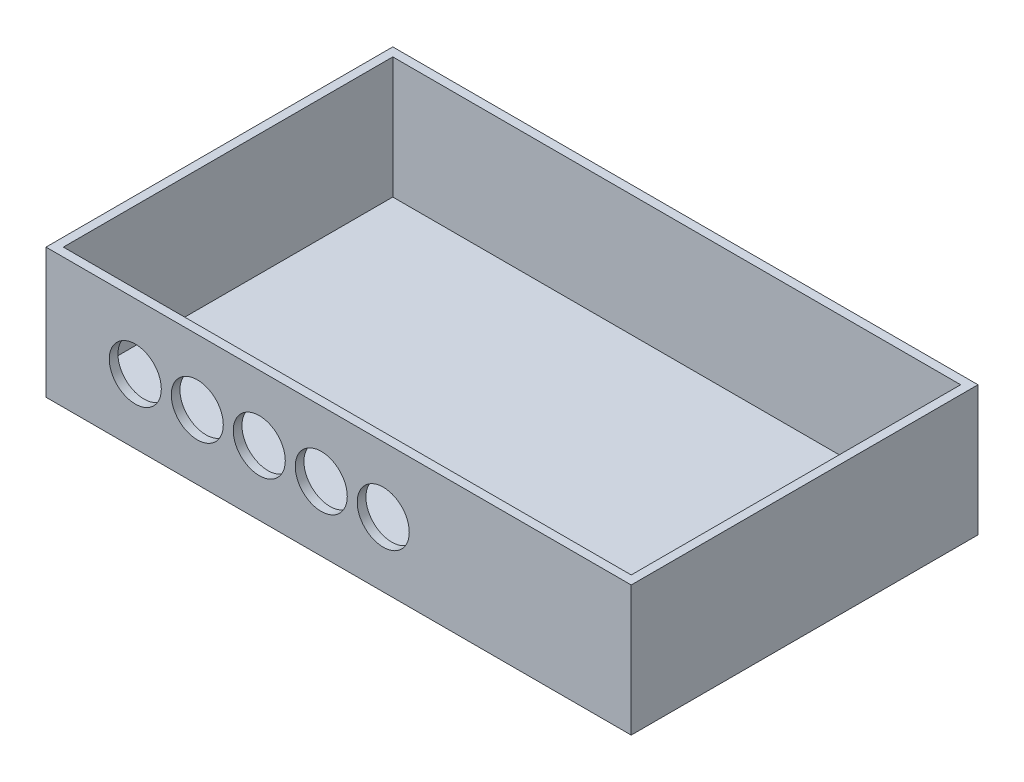
ISO-10303-21;
HEADER;
FILE_DESCRIPTION(('STEP AP214'),'2;1');
FILE_NAME('part.step','',(''),(''),'','','');
FILE_SCHEMA(('AUTOMOTIVE_DESIGN { 1 0 10303 214 1 1 1 1 }'));
ENDSEC;
DATA;
#1=APPLICATION_CONTEXT('core data for automotive mechanical design processes');
#2=APPLICATION_PROTOCOL_DEFINITION('international standard','automotive_design',2000,#1);
#3=PRODUCT_CONTEXT('',#1,'mechanical');
#4=PRODUCT('Part','Part','',(#3));
#5=PRODUCT_RELATED_PRODUCT_CATEGORY('part','',(#4));
#6=PRODUCT_DEFINITION_FORMATION('','',#4);
#7=PRODUCT_DEFINITION_CONTEXT('part definition',#1,'design');
#8=PRODUCT_DEFINITION('design','',#6,#7);
#9=PRODUCT_DEFINITION_SHAPE('','',#8);
#10=(LENGTH_UNIT() NAMED_UNIT(*) SI_UNIT(.MILLI.,.METRE.));
#11=(NAMED_UNIT(*) PLANE_ANGLE_UNIT() SI_UNIT($,.RADIAN.));
#12=(NAMED_UNIT(*) SI_UNIT($,.STERADIAN.) SOLID_ANGLE_UNIT());
#13=UNCERTAINTY_MEASURE_WITH_UNIT(LENGTH_MEASURE(1.E-05),#10,'distance_accuracy_value','');
#14=(GEOMETRIC_REPRESENTATION_CONTEXT(3) GLOBAL_UNCERTAINTY_ASSIGNED_CONTEXT((#13)) GLOBAL_UNIT_ASSIGNED_CONTEXT((#10,
#11,#12)) REPRESENTATION_CONTEXT('',''));
#15=CARTESIAN_POINT('',(0.,0.,0.));
#16=DIRECTION('',(0.,0.,1.));
#17=DIRECTION('',(1.,0.,0.));
#18=AXIS2_PLACEMENT_3D('',#15,#16,#17);
#19=CARTESIAN_POINT('',(0.,30.,0.));
#20=DIRECTION('',(0.,-1.,0.));
#21=DIRECTION('',(0.,0.,-1.));
#22=AXIS2_PLACEMENT_3D('',#19,#20,#21);
#23=PLANE('',#22);
#24=DIRECTION('',(0.,0.,1.));
#25=VECTOR('',#24,1.);
#26=CARTESIAN_POINT('',(0.,30.,0.));
#27=LINE('',#26,#25);
#28=CARTESIAN_POINT('',(0.,30.,-80.));
#29=VERTEX_POINT('',#28);
#30=CARTESIAN_POINT('',(0.,30.,0.));
#31=VERTEX_POINT('',#30);
#32=EDGE_CURVE('E143',#29,#31,#27,.T.);
#33=ORIENTED_EDGE('',*,*,#32,.T.);
#34=DIRECTION('',(1.,0.,0.));
#35=VECTOR('',#34,1.);
#36=CARTESIAN_POINT('',(0.,30.,0.));
#37=LINE('',#36,#35);
#38=CARTESIAN_POINT('',(135.,30.,0.));
#39=VERTEX_POINT('',#38);
#40=EDGE_CURVE('E87',#31,#39,#37,.T.);
#41=ORIENTED_EDGE('',*,*,#40,.T.);
#42=DIRECTION('',(0.,0.,-1.));
#43=VECTOR('',#42,1.);
#44=CARTESIAN_POINT('',(135.,30.,0.));
#45=LINE('',#44,#43);
#46=CARTESIAN_POINT('',(135.,30.,-80.));
#47=VERTEX_POINT('',#46);
#48=EDGE_CURVE('E146',#39,#47,#45,.T.);
#49=ORIENTED_EDGE('',*,*,#48,.T.);
#50=DIRECTION('',(-1.,0.,0.));
#51=VECTOR('',#50,1.);
#52=CARTESIAN_POINT('',(0.,30.,-80.));
#53=LINE('',#52,#51);
#54=EDGE_CURVE('E59',#47,#29,#53,.T.);
#55=ORIENTED_EDGE('',*,*,#54,.T.);
#56=EDGE_LOOP('',(#33,#41,#49,#55));
#57=FACE_BOUND('',#56,.T.);
#58=DIRECTION('',(0.,0.,1.));
#59=VECTOR('',#58,1.);
#60=CARTESIAN_POINT('',(2.,30.,0.));
#61=LINE('',#60,#59);
#62=CARTESIAN_POINT('',(2.,30.,-78.));
#63=VERTEX_POINT('',#62);
#64=CARTESIAN_POINT('',(2.,30.,-2.));
#65=VERTEX_POINT('',#64);
#66=EDGE_CURVE('E132',#63,#65,#61,.T.);
#67=ORIENTED_EDGE('',*,*,#66,.F.);
#68=DIRECTION('',(-1.,0.,0.));
#69=VECTOR('',#68,1.);
#70=CARTESIAN_POINT('',(0.,30.,-78.));
#71=LINE('',#70,#69);
#72=CARTESIAN_POINT('',(133.,30.,-78.));
#73=VERTEX_POINT('',#72);
#74=EDGE_CURVE('E141',#73,#63,#71,.T.);
#75=ORIENTED_EDGE('',*,*,#74,.F.);
#76=DIRECTION('',(0.,0.,-1.));
#77=VECTOR('',#76,1.);
#78=CARTESIAN_POINT('',(133.,30.,0.));
#79=LINE('',#78,#77);
#80=CARTESIAN_POINT('',(133.,30.,-2.));
#81=VERTEX_POINT('',#80);
#82=EDGE_CURVE('E139',#81,#73,#79,.T.);
#83=ORIENTED_EDGE('',*,*,#82,.F.);
#84=DIRECTION('',(1.,0.,0.));
#85=VECTOR('',#84,1.);
#86=CARTESIAN_POINT('',(0.,30.,-2.));
#87=LINE('',#86,#85);
#88=EDGE_CURVE('E124',#65,#81,#87,.T.);
#89=ORIENTED_EDGE('',*,*,#88,.F.);
#90=EDGE_LOOP('',(#67,#75,#83,#89));
#91=FACE_BOUND('',#90,.T.);
#92=ADVANCED_FACE('F33',(#57,#91),#23,.F.);
#93=CARTESIAN_POINT('',(0.,30.,0.));
#94=DIRECTION('',(1.,0.,0.));
#95=DIRECTION('',(0.,0.,-1.));
#96=AXIS2_PLACEMENT_3D('',#93,#94,#95);
#97=PLANE('',#96);
#98=DIRECTION('',(0.,0.,1.));
#99=VECTOR('',#98,1.);
#100=CARTESIAN_POINT('',(0.,0.,0.));
#101=LINE('',#100,#99);
#102=CARTESIAN_POINT('',(0.,0.,-80.));
#103=VERTEX_POINT('',#102);
#104=CARTESIAN_POINT('',(0.,0.,0.));
#105=VERTEX_POINT('',#104);
#106=EDGE_CURVE('E150',#103,#105,#101,.T.);
#107=ORIENTED_EDGE('',*,*,#106,.T.);
#108=DIRECTION('',(0.,-1.,0.));
#109=VECTOR('',#108,1.);
#110=CARTESIAN_POINT('',(0.,30.,0.));
#111=LINE('',#110,#109);
#112=EDGE_CURVE('E11',#31,#105,#111,.T.);
#113=ORIENTED_EDGE('',*,*,#112,.F.);
#114=ORIENTED_EDGE('',*,*,#32,.F.);
#115=DIRECTION('',(0.,-1.,0.));
#116=VECTOR('',#115,1.);
#117=CARTESIAN_POINT('',(0.,30.,-80.));
#118=LINE('',#117,#116);
#119=EDGE_CURVE('E149',#29,#103,#118,.T.);
#120=ORIENTED_EDGE('',*,*,#119,.T.);
#121=EDGE_LOOP('',(#107,#113,#114,#120));
#122=FACE_BOUND('',#121,.T.);
#123=ADVANCED_FACE('F35',(#122),#97,.F.);
#124=CARTESIAN_POINT('',(0.,30.,0.));
#125=DIRECTION('',(0.,0.,-1.));
#126=DIRECTION('',(-1.,0.,0.));
#127=AXIS2_PLACEMENT_3D('',#124,#125,#126);
#128=PLANE('',#127);
#129=CARTESIAN_POINT('',(20.6,14.94,0.));
#130=DIRECTION('',(0.,0.,1.));
#131=DIRECTION('',(1.,0.,0.));
#132=AXIS2_PLACEMENT_3D('',#129,#130,#131);
#133=CIRCLE('',#132,6.);
#134=CARTESIAN_POINT('',(26.6,14.94,0.));
#135=VERTEX_POINT('',#134);
#136=EDGE_CURVE('E167',#135,#135,#133,.T.);
#137=ORIENTED_EDGE('',*,*,#136,.F.);
#138=EDGE_LOOP('',(#137));
#139=FACE_BOUND('',#138,.T.);
#140=CARTESIAN_POINT('',(34.9,14.94,0.));
#141=DIRECTION('',(0.,0.,1.));
#142=DIRECTION('',(1.,0.,0.));
#143=AXIS2_PLACEMENT_3D('',#140,#141,#142);
#144=CIRCLE('',#143,6.);
#145=CARTESIAN_POINT('',(40.9,14.94,0.));
#146=VERTEX_POINT('',#145);
#147=EDGE_CURVE('E225',#146,#146,#144,.T.);
#148=ORIENTED_EDGE('',*,*,#147,.F.);
#149=EDGE_LOOP('',(#148));
#150=FACE_BOUND('',#149,.T.);
#151=CARTESIAN_POINT('',(49.2,14.94,0.));
#152=DIRECTION('',(0.,0.,1.));
#153=DIRECTION('',(1.,0.,0.));
#154=AXIS2_PLACEMENT_3D('',#151,#152,#153);
#155=CIRCLE('',#154,5.99999999999999);
#156=CARTESIAN_POINT('',(55.2,14.94,0.));
#157=VERTEX_POINT('',#156);
#158=EDGE_CURVE('E229',#157,#157,#155,.T.);
#159=ORIENTED_EDGE('',*,*,#158,.F.);
#160=EDGE_LOOP('',(#159));
#161=FACE_BOUND('',#160,.T.);
#162=CARTESIAN_POINT('',(63.5,14.94,0.));
#163=DIRECTION('',(0.,0.,1.));
#164=DIRECTION('',(1.,0.,0.));
#165=AXIS2_PLACEMENT_3D('',#162,#163,#164);
#166=CIRCLE('',#165,6.);
#167=CARTESIAN_POINT('',(69.5,14.94,0.));
#168=VERTEX_POINT('',#167);
#169=EDGE_CURVE('E233',#168,#168,#166,.T.);
#170=ORIENTED_EDGE('',*,*,#169,.F.);
#171=EDGE_LOOP('',(#170));
#172=FACE_BOUND('',#171,.T.);
#173=CARTESIAN_POINT('',(77.8,14.94,0.));
#174=DIRECTION('',(0.,0.,1.));
#175=DIRECTION('',(1.,0.,0.));
#176=AXIS2_PLACEMENT_3D('',#173,#174,#175);
#177=CIRCLE('',#176,6.);
#178=CARTESIAN_POINT('',(83.8,14.94,0.));
#179=VERTEX_POINT('',#178);
#180=EDGE_CURVE('E182',#179,#179,#177,.T.);
#181=ORIENTED_EDGE('',*,*,#180,.F.);
#182=EDGE_LOOP('',(#181));
#183=FACE_BOUND('',#182,.T.);
#184=DIRECTION('',(1.,0.,0.));
#185=VECTOR('',#184,1.);
#186=CARTESIAN_POINT('',(0.,0.,0.));
#187=LINE('',#186,#185);
#188=CARTESIAN_POINT('',(135.,0.,0.));
#189=VERTEX_POINT('',#188);
#190=EDGE_CURVE('E153',#105,#189,#187,.T.);
#191=ORIENTED_EDGE('',*,*,#190,.T.);
#192=DIRECTION('',(0.,-1.,0.));
#193=VECTOR('',#192,1.);
#194=CARTESIAN_POINT('',(135.,30.,0.));
#195=LINE('',#194,#193);
#196=EDGE_CURVE('E42',#39,#189,#195,.T.);
#197=ORIENTED_EDGE('',*,*,#196,.F.);
#198=ORIENTED_EDGE('',*,*,#40,.F.);
#199=ORIENTED_EDGE('',*,*,#112,.T.);
#200=EDGE_LOOP('',(#191,#197,#198,#199));
#201=FACE_BOUND('',#200,.T.);
#202=ADVANCED_FACE('F198',(#139,#150,#161,#172,#183,#201),#128,.F.);
#203=CARTESIAN_POINT('',(135.,30.,0.));
#204=DIRECTION('',(-1.,0.,0.));
#205=DIRECTION('',(0.,0.,1.));
#206=AXIS2_PLACEMENT_3D('',#203,#204,#205);
#207=PLANE('',#206);
#208=DIRECTION('',(0.,0.,-1.));
#209=VECTOR('',#208,1.);
#210=CARTESIAN_POINT('',(135.,0.,0.));
#211=LINE('',#210,#209);
#212=CARTESIAN_POINT('',(135.,0.,-80.));
#213=VERTEX_POINT('',#212);
#214=EDGE_CURVE('E155',#189,#213,#211,.T.);
#215=ORIENTED_EDGE('',*,*,#214,.T.);
#216=DIRECTION('',(0.,-1.,0.));
#217=VECTOR('',#216,1.);
#218=CARTESIAN_POINT('',(135.,30.,-80.));
#219=LINE('',#218,#217);
#220=EDGE_CURVE('E159',#47,#213,#219,.T.);
#221=ORIENTED_EDGE('',*,*,#220,.F.);
#222=ORIENTED_EDGE('',*,*,#48,.F.);
#223=ORIENTED_EDGE('',*,*,#196,.T.);
#224=EDGE_LOOP('',(#215,#221,#222,#223));
#225=FACE_BOUND('',#224,.T.);
#226=ADVANCED_FACE('F210',(#225),#207,.F.);
#227=CARTESIAN_POINT('',(0.,30.,-80.));
#228=DIRECTION('',(0.,0.,1.));
#229=DIRECTION('',(1.,0.,0.));
#230=AXIS2_PLACEMENT_3D('',#227,#228,#229);
#231=PLANE('',#230);
#232=DIRECTION('',(-1.,0.,0.));
#233=VECTOR('',#232,1.);
#234=CARTESIAN_POINT('',(0.,0.,-80.));
#235=LINE('',#234,#233);
#236=EDGE_CURVE('E80',#213,#103,#235,.T.);
#237=ORIENTED_EDGE('',*,*,#236,.T.);
#238=ORIENTED_EDGE('',*,*,#119,.F.);
#239=ORIENTED_EDGE('',*,*,#54,.F.);
#240=ORIENTED_EDGE('',*,*,#220,.T.);
#241=EDGE_LOOP('',(#237,#238,#239,#240));
#242=FACE_BOUND('',#241,.T.);
#243=ADVANCED_FACE('F206',(#242),#231,.F.);
#244=CARTESIAN_POINT('',(0.,0.,0.));
#245=DIRECTION('',(0.,-1.,0.));
#246=DIRECTION('',(0.,0.,-1.));
#247=AXIS2_PLACEMENT_3D('',#244,#245,#246);
#248=PLANE('',#247);
#249=ORIENTED_EDGE('',*,*,#106,.F.);
#250=ORIENTED_EDGE('',*,*,#236,.F.);
#251=ORIENTED_EDGE('',*,*,#214,.F.);
#252=ORIENTED_EDGE('',*,*,#190,.F.);
#253=EDGE_LOOP('',(#249,#250,#251,#252));
#254=FACE_BOUND('',#253,.T.);
#255=ADVANCED_FACE('F203',(#254),#248,.T.);
#256=CARTESIAN_POINT('',(2.,30.,0.));
#257=DIRECTION('',(1.,0.,0.));
#258=DIRECTION('',(0.,0.,-1.));
#259=AXIS2_PLACEMENT_3D('',#256,#257,#258);
#260=PLANE('',#259);
#261=DIRECTION('',(0.,0.,1.));
#262=VECTOR('',#261,1.);
#263=CARTESIAN_POINT('',(2.,2.,0.));
#264=LINE('',#263,#262);
#265=CARTESIAN_POINT('',(2.,2.,-78.));
#266=VERTEX_POINT('',#265);
#267=CARTESIAN_POINT('',(2.,2.,-2.));
#268=VERTEX_POINT('',#267);
#269=EDGE_CURVE('E115',#266,#268,#264,.T.);
#270=ORIENTED_EDGE('',*,*,#269,.F.);
#271=DIRECTION('',(0.,-1.,0.));
#272=VECTOR('',#271,1.);
#273=CARTESIAN_POINT('',(2.,30.,-78.));
#274=LINE('',#273,#272);
#275=EDGE_CURVE('E135',#63,#266,#274,.T.);
#276=ORIENTED_EDGE('',*,*,#275,.F.);
#277=ORIENTED_EDGE('',*,*,#66,.T.);
#278=DIRECTION('',(0.,-1.,0.));
#279=VECTOR('',#278,1.);
#280=CARTESIAN_POINT('',(2.,30.,-2.));
#281=LINE('',#280,#279);
#282=EDGE_CURVE('E127',#65,#268,#281,.T.);
#283=ORIENTED_EDGE('',*,*,#282,.T.);
#284=EDGE_LOOP('',(#270,#276,#277,#283));
#285=FACE_BOUND('',#284,.T.);
#286=ADVANCED_FACE('F191',(#285),#260,.T.);
#287=CARTESIAN_POINT('',(0.,30.,-2.));
#288=DIRECTION('',(0.,0.,-1.));
#289=DIRECTION('',(-1.,0.,0.));
#290=AXIS2_PLACEMENT_3D('',#287,#288,#289);
#291=PLANE('',#290);
#292=CARTESIAN_POINT('',(20.6,14.94,-2.));
#293=DIRECTION('',(0.,0.,-1.));
#294=DIRECTION('',(-1.,0.,0.));
#295=AXIS2_PLACEMENT_3D('',#292,#293,#294);
#296=CIRCLE('',#295,6.);
#297=CARTESIAN_POINT('',(14.6,14.94,-2.));
#298=VERTEX_POINT('',#297);
#299=EDGE_CURVE('E37',#298,#298,#296,.T.);
#300=ORIENTED_EDGE('',*,*,#299,.F.);
#301=EDGE_LOOP('',(#300));
#302=FACE_BOUND('',#301,.T.);
#303=CARTESIAN_POINT('',(34.9,14.94,-2.));
#304=DIRECTION('',(0.,0.,-1.));
#305=DIRECTION('',(-1.,0.,0.));
#306=AXIS2_PLACEMENT_3D('',#303,#304,#305);
#307=CIRCLE('',#306,6.);
#308=CARTESIAN_POINT('',(28.9,14.94,-2.));
#309=VERTEX_POINT('',#308);
#310=EDGE_CURVE('E172',#309,#309,#307,.T.);
#311=ORIENTED_EDGE('',*,*,#310,.F.);
#312=EDGE_LOOP('',(#311));
#313=FACE_BOUND('',#312,.T.);
#314=CARTESIAN_POINT('',(49.2,14.94,-2.));
#315=DIRECTION('',(0.,0.,-1.));
#316=DIRECTION('',(-1.,0.,0.));
#317=AXIS2_PLACEMENT_3D('',#314,#315,#316);
#318=CIRCLE('',#317,5.99999999999999);
#319=CARTESIAN_POINT('',(43.2,14.94,-2.));
#320=VERTEX_POINT('',#319);
#321=EDGE_CURVE('E170',#320,#320,#318,.T.);
#322=ORIENTED_EDGE('',*,*,#321,.F.);
#323=EDGE_LOOP('',(#322));
#324=FACE_BOUND('',#323,.T.);
#325=CARTESIAN_POINT('',(63.5,14.94,-2.));
#326=DIRECTION('',(0.,0.,-1.));
#327=DIRECTION('',(-1.,0.,0.));
#328=AXIS2_PLACEMENT_3D('',#325,#326,#327);
#329=CIRCLE('',#328,6.);
#330=CARTESIAN_POINT('',(57.5,14.94,-2.));
#331=VERTEX_POINT('',#330);
#332=EDGE_CURVE('E166',#331,#331,#329,.T.);
#333=ORIENTED_EDGE('',*,*,#332,.F.);
#334=EDGE_LOOP('',(#333));
#335=FACE_BOUND('',#334,.T.);
#336=CARTESIAN_POINT('',(77.8,14.94,-2.));
#337=DIRECTION('',(0.,0.,-1.));
#338=DIRECTION('',(-1.,0.,0.));
#339=AXIS2_PLACEMENT_3D('',#336,#337,#338);
#340=CIRCLE('',#339,6.);
#341=CARTESIAN_POINT('',(71.8,14.94,-2.));
#342=VERTEX_POINT('',#341);
#343=EDGE_CURVE('E163',#342,#342,#340,.T.);
#344=ORIENTED_EDGE('',*,*,#343,.F.);
#345=EDGE_LOOP('',(#344));
#346=FACE_BOUND('',#345,.T.);
#347=DIRECTION('',(1.,0.,0.));
#348=VECTOR('',#347,1.);
#349=CARTESIAN_POINT('',(0.,2.,-2.));
#350=LINE('',#349,#348);
#351=CARTESIAN_POINT('',(133.,2.,-2.));
#352=VERTEX_POINT('',#351);
#353=EDGE_CURVE('E109',#268,#352,#350,.T.);
#354=ORIENTED_EDGE('',*,*,#353,.F.);
#355=ORIENTED_EDGE('',*,*,#282,.F.);
#356=ORIENTED_EDGE('',*,*,#88,.T.);
#357=DIRECTION('',(0.,-1.,0.));
#358=VECTOR('',#357,1.);
#359=CARTESIAN_POINT('',(133.,30.,-2.));
#360=LINE('',#359,#358);
#361=EDGE_CURVE('E121',#81,#352,#360,.T.);
#362=ORIENTED_EDGE('',*,*,#361,.T.);
#363=EDGE_LOOP('',(#354,#355,#356,#362));
#364=FACE_BOUND('',#363,.T.);
#365=ADVANCED_FACE('F122',(#302,#313,#324,#335,#346,#364),#291,.T.);
#366=CARTESIAN_POINT('',(133.,30.,0.));
#367=DIRECTION('',(-1.,0.,0.));
#368=DIRECTION('',(0.,0.,1.));
#369=AXIS2_PLACEMENT_3D('',#366,#367,#368);
#370=PLANE('',#369);
#371=DIRECTION('',(0.,0.,-1.));
#372=VECTOR('',#371,1.);
#373=CARTESIAN_POINT('',(133.,2.,0.));
#374=LINE('',#373,#372);
#375=CARTESIAN_POINT('',(133.,2.,-78.));
#376=VERTEX_POINT('',#375);
#377=EDGE_CURVE('E113',#352,#376,#374,.T.);
#378=ORIENTED_EDGE('',*,*,#377,.F.);
#379=ORIENTED_EDGE('',*,*,#361,.F.);
#380=ORIENTED_EDGE('',*,*,#82,.T.);
#381=DIRECTION('',(0.,-1.,0.));
#382=VECTOR('',#381,1.);
#383=CARTESIAN_POINT('',(133.,30.,-78.));
#384=LINE('',#383,#382);
#385=EDGE_CURVE('E50',#73,#376,#384,.T.);
#386=ORIENTED_EDGE('',*,*,#385,.T.);
#387=EDGE_LOOP('',(#378,#379,#380,#386));
#388=FACE_BOUND('',#387,.T.);
#389=ADVANCED_FACE('F129',(#388),#370,.T.);
#390=CARTESIAN_POINT('',(0.,30.,-78.));
#391=DIRECTION('',(0.,0.,1.));
#392=DIRECTION('',(1.,0.,0.));
#393=AXIS2_PLACEMENT_3D('',#390,#391,#392);
#394=PLANE('',#393);
#395=DIRECTION('',(-1.,0.,0.));
#396=VECTOR('',#395,1.);
#397=CARTESIAN_POINT('',(0.,2.,-78.));
#398=LINE('',#397,#396);
#399=EDGE_CURVE('E130',#376,#266,#398,.T.);
#400=ORIENTED_EDGE('',*,*,#399,.F.);
#401=ORIENTED_EDGE('',*,*,#385,.F.);
#402=ORIENTED_EDGE('',*,*,#74,.T.);
#403=ORIENTED_EDGE('',*,*,#275,.T.);
#404=EDGE_LOOP('',(#400,#401,#402,#403));
#405=FACE_BOUND('',#404,.T.);
#406=ADVANCED_FACE('F187',(#405),#394,.T.);
#407=CARTESIAN_POINT('',(0.,2.,0.));
#408=DIRECTION('',(0.,-1.,0.));
#409=DIRECTION('',(0.,0.,-1.));
#410=AXIS2_PLACEMENT_3D('',#407,#408,#409);
#411=PLANE('',#410);
#412=ORIENTED_EDGE('',*,*,#269,.T.);
#413=ORIENTED_EDGE('',*,*,#353,.T.);
#414=ORIENTED_EDGE('',*,*,#377,.T.);
#415=ORIENTED_EDGE('',*,*,#399,.T.);
#416=EDGE_LOOP('',(#412,#413,#414,#415));
#417=FACE_BOUND('',#416,.T.);
#418=ADVANCED_FACE('F111',(#417),#411,.F.);
#419=CARTESIAN_POINT('',(77.8,14.94,-30.));
#420=DIRECTION('',(0.,0.,1.));
#421=DIRECTION('',(1.,0.,0.));
#422=AXIS2_PLACEMENT_3D('',#419,#420,#421);
#423=CYLINDRICAL_SURFACE('',#422,6.);
#424=ORIENTED_EDGE('',*,*,#343,.T.);
#425=EDGE_LOOP('',(#424));
#426=FACE_BOUND('',#425,.T.);
#427=ORIENTED_EDGE('',*,*,#180,.T.);
#428=EDGE_LOOP('',(#427));
#429=FACE_BOUND('',#428,.T.);
#430=ADVANCED_FACE('F264',(#426,#429),#423,.F.);
#431=CARTESIAN_POINT('',(63.5,14.94,-30.));
#432=DIRECTION('',(0.,0.,1.));
#433=DIRECTION('',(1.,0.,0.));
#434=AXIS2_PLACEMENT_3D('',#431,#432,#433);
#435=CYLINDRICAL_SURFACE('',#434,6.);
#436=ORIENTED_EDGE('',*,*,#332,.T.);
#437=EDGE_LOOP('',(#436));
#438=FACE_BOUND('',#437,.T.);
#439=ORIENTED_EDGE('',*,*,#169,.T.);
#440=EDGE_LOOP('',(#439));
#441=FACE_BOUND('',#440,.T.);
#442=ADVANCED_FACE('F260',(#438,#441),#435,.F.);
#443=CARTESIAN_POINT('',(49.2,14.94,-30.));
#444=DIRECTION('',(0.,0.,1.));
#445=DIRECTION('',(1.,0.,0.));
#446=AXIS2_PLACEMENT_3D('',#443,#444,#445);
#447=CYLINDRICAL_SURFACE('',#446,5.99999999999999);
#448=ORIENTED_EDGE('',*,*,#321,.T.);
#449=EDGE_LOOP('',(#448));
#450=FACE_BOUND('',#449,.T.);
#451=ORIENTED_EDGE('',*,*,#158,.T.);
#452=EDGE_LOOP('',(#451));
#453=FACE_BOUND('',#452,.T.);
#454=ADVANCED_FACE('F255',(#450,#453),#447,.F.);
#455=CARTESIAN_POINT('',(34.9,14.94,-30.));
#456=DIRECTION('',(0.,0.,1.));
#457=DIRECTION('',(1.,0.,0.));
#458=AXIS2_PLACEMENT_3D('',#455,#456,#457);
#459=CYLINDRICAL_SURFACE('',#458,6.);
#460=ORIENTED_EDGE('',*,*,#310,.T.);
#461=EDGE_LOOP('',(#460));
#462=FACE_BOUND('',#461,.T.);
#463=ORIENTED_EDGE('',*,*,#147,.T.);
#464=EDGE_LOOP('',(#463));
#465=FACE_BOUND('',#464,.T.);
#466=ADVANCED_FACE('F250',(#462,#465),#459,.F.);
#467=CARTESIAN_POINT('',(20.6,14.94,-30.));
#468=DIRECTION('',(0.,0.,1.));
#469=DIRECTION('',(1.,0.,0.));
#470=AXIS2_PLACEMENT_3D('',#467,#468,#469);
#471=CYLINDRICAL_SURFACE('',#470,6.);
#472=ORIENTED_EDGE('',*,*,#299,.T.);
#473=EDGE_LOOP('',(#472));
#474=FACE_BOUND('',#473,.T.);
#475=ORIENTED_EDGE('',*,*,#136,.T.);
#476=EDGE_LOOP('',(#475));
#477=FACE_BOUND('',#476,.T.);
#478=ADVANCED_FACE('F248',(#474,#477),#471,.F.);
#479=CLOSED_SHELL('',(#92,#123,#202,#226,#243,#255,#286,#365,#389,#406,#418,#430,#442,#454,#466,#478));
#480=MANIFOLD_SOLID_BREP('B2',#479);
#481=ADVANCED_BREP_SHAPE_REPRESENTATION('',(#18,#480),#14);
#482=SHAPE_DEFINITION_REPRESENTATION(#9,#481);
ENDSEC;
END-ISO-10303-21;
